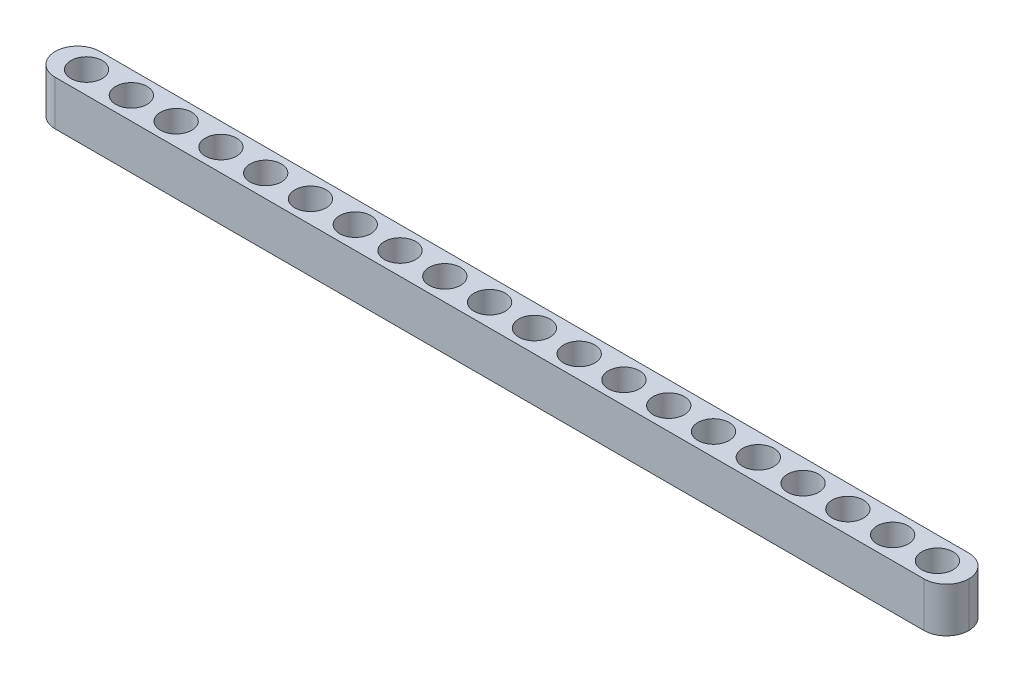
ISO-10303-21;
HEADER;
FILE_DESCRIPTION(('STEP AP214'),'2;1');
FILE_NAME('part.step','',(''),(''),'','','');
FILE_SCHEMA(('AUTOMOTIVE_DESIGN { 1 0 10303 214 1 1 1 1 }'));
ENDSEC;
DATA;
#1=APPLICATION_CONTEXT('core data for automotive mechanical design processes');
#2=APPLICATION_PROTOCOL_DEFINITION('international standard','automotive_design',2000,#1);
#3=PRODUCT_CONTEXT('',#1,'mechanical');
#4=PRODUCT('Part','Part','',(#3));
#5=PRODUCT_RELATED_PRODUCT_CATEGORY('part','',(#4));
#6=PRODUCT_DEFINITION_FORMATION('','',#4);
#7=PRODUCT_DEFINITION_CONTEXT('part definition',#1,'design');
#8=PRODUCT_DEFINITION('design','',#6,#7);
#9=PRODUCT_DEFINITION_SHAPE('','',#8);
#10=(LENGTH_UNIT() NAMED_UNIT(*) SI_UNIT(.MILLI.,.METRE.));
#11=(NAMED_UNIT(*) PLANE_ANGLE_UNIT() SI_UNIT($,.RADIAN.));
#12=(NAMED_UNIT(*) SI_UNIT($,.STERADIAN.) SOLID_ANGLE_UNIT());
#13=UNCERTAINTY_MEASURE_WITH_UNIT(LENGTH_MEASURE(1.E-05),#10,'distance_accuracy_value','');
#14=(GEOMETRIC_REPRESENTATION_CONTEXT(3) GLOBAL_UNCERTAINTY_ASSIGNED_CONTEXT((#13)) GLOBAL_UNIT_ASSIGNED_CONTEXT((#10,
#11,#12)) REPRESENTATION_CONTEXT('',''));
#15=CARTESIAN_POINT('',(0.,0.,0.));
#16=DIRECTION('',(0.,0.,1.));
#17=DIRECTION('',(1.,0.,0.));
#18=AXIS2_PLACEMENT_3D('',#15,#16,#17);
#19=CARTESIAN_POINT('',(197.,0.,-5.));
#20=DIRECTION('',(0.,1.,0.));
#21=DIRECTION('',(0.,0.,1.));
#22=AXIS2_PLACEMENT_3D('',#19,#20,#21);
#23=CYLINDRICAL_SURFACE('',#22,3.5);
#24=CARTESIAN_POINT('',(197.,0.,-5.));
#25=DIRECTION('',(0.,1.,0.));
#26=DIRECTION('',(0.,0.,1.));
#27=AXIS2_PLACEMENT_3D('',#24,#25,#26);
#28=CIRCLE('',#27,3.5);
#29=CARTESIAN_POINT('',(197.,0.,-1.5));
#30=VERTEX_POINT('',#29);
#31=EDGE_CURVE('E132',#30,#30,#28,.T.);
#32=ORIENTED_EDGE('',*,*,#31,.F.);
#33=EDGE_LOOP('',(#32));
#34=FACE_BOUND('',#33,.T.);
#35=CARTESIAN_POINT('',(197.,10.,-5.));
#36=DIRECTION('',(0.,1.,0.));
#37=DIRECTION('',(0.,0.,1.));
#38=AXIS2_PLACEMENT_3D('',#35,#36,#37);
#39=CIRCLE('',#38,3.5);
#40=CARTESIAN_POINT('',(197.,10.,-1.5));
#41=VERTEX_POINT('',#40);
#42=EDGE_CURVE('E128',#41,#41,#39,.T.);
#43=ORIENTED_EDGE('',*,*,#42,.T.);
#44=EDGE_LOOP('',(#43));
#45=FACE_BOUND('',#44,.T.);
#46=ADVANCED_FACE('F46',(#34,#45),#23,.F.);
#47=CARTESIAN_POINT('',(187.,0.,-5.));
#48=DIRECTION('',(0.,1.,0.));
#49=DIRECTION('',(0.,0.,1.));
#50=AXIS2_PLACEMENT_3D('',#47,#48,#49);
#51=CYLINDRICAL_SURFACE('',#50,3.5);
#52=CARTESIAN_POINT('',(187.,0.,-5.));
#53=DIRECTION('',(0.,1.,0.));
#54=DIRECTION('',(0.,0.,1.));
#55=AXIS2_PLACEMENT_3D('',#52,#53,#54);
#56=CIRCLE('',#55,3.5);
#57=CARTESIAN_POINT('',(187.,0.,-1.5));
#58=VERTEX_POINT('',#57);
#59=EDGE_CURVE('E260',#58,#58,#56,.T.);
#60=ORIENTED_EDGE('',*,*,#59,.F.);
#61=EDGE_LOOP('',(#60));
#62=FACE_BOUND('',#61,.T.);
#63=CARTESIAN_POINT('',(187.,10.,-5.));
#64=DIRECTION('',(0.,1.,0.));
#65=DIRECTION('',(0.,0.,1.));
#66=AXIS2_PLACEMENT_3D('',#63,#64,#65);
#67=CIRCLE('',#66,3.5);
#68=CARTESIAN_POINT('',(187.,10.,-1.5));
#69=VERTEX_POINT('',#68);
#70=EDGE_CURVE('E263',#69,#69,#67,.T.);
#71=ORIENTED_EDGE('',*,*,#70,.T.);
#72=EDGE_LOOP('',(#71));
#73=FACE_BOUND('',#72,.T.);
#74=ADVANCED_FACE('F271',(#62,#73),#51,.F.);
#75=CARTESIAN_POINT('',(177.,0.,-5.));
#76=DIRECTION('',(0.,1.,0.));
#77=DIRECTION('',(0.,0.,1.));
#78=AXIS2_PLACEMENT_3D('',#75,#76,#77);
#79=CYLINDRICAL_SURFACE('',#78,3.5);
#80=CARTESIAN_POINT('',(177.,0.,-5.));
#81=DIRECTION('',(0.,1.,0.));
#82=DIRECTION('',(0.,0.,1.));
#83=AXIS2_PLACEMENT_3D('',#80,#81,#82);
#84=CIRCLE('',#83,3.5);
#85=CARTESIAN_POINT('',(177.,0.,-1.5));
#86=VERTEX_POINT('',#85);
#87=EDGE_CURVE('E254',#86,#86,#84,.T.);
#88=ORIENTED_EDGE('',*,*,#87,.F.);
#89=EDGE_LOOP('',(#88));
#90=FACE_BOUND('',#89,.T.);
#91=CARTESIAN_POINT('',(177.,10.,-5.));
#92=DIRECTION('',(0.,1.,0.));
#93=DIRECTION('',(0.,0.,1.));
#94=AXIS2_PLACEMENT_3D('',#91,#92,#93);
#95=CIRCLE('',#94,3.5);
#96=CARTESIAN_POINT('',(177.,10.,-1.5));
#97=VERTEX_POINT('',#96);
#98=EDGE_CURVE('E257',#97,#97,#95,.T.);
#99=ORIENTED_EDGE('',*,*,#98,.T.);
#100=EDGE_LOOP('',(#99));
#101=FACE_BOUND('',#100,.T.);
#102=ADVANCED_FACE('F356',(#90,#101),#79,.F.);
#103=CARTESIAN_POINT('',(167.,0.,-5.));
#104=DIRECTION('',(0.,1.,0.));
#105=DIRECTION('',(0.,0.,1.));
#106=AXIS2_PLACEMENT_3D('',#103,#104,#105);
#107=CYLINDRICAL_SURFACE('',#106,3.5);
#108=CARTESIAN_POINT('',(167.,0.,-5.));
#109=DIRECTION('',(0.,1.,0.));
#110=DIRECTION('',(0.,0.,1.));
#111=AXIS2_PLACEMENT_3D('',#108,#109,#110);
#112=CIRCLE('',#111,3.5);
#113=CARTESIAN_POINT('',(167.,0.,-1.5));
#114=VERTEX_POINT('',#113);
#115=EDGE_CURVE('E248',#114,#114,#112,.T.);
#116=ORIENTED_EDGE('',*,*,#115,.F.);
#117=EDGE_LOOP('',(#116));
#118=FACE_BOUND('',#117,.T.);
#119=CARTESIAN_POINT('',(167.,10.,-5.));
#120=DIRECTION('',(0.,1.,0.));
#121=DIRECTION('',(0.,0.,1.));
#122=AXIS2_PLACEMENT_3D('',#119,#120,#121);
#123=CIRCLE('',#122,3.5);
#124=CARTESIAN_POINT('',(167.,10.,-1.5));
#125=VERTEX_POINT('',#124);
#126=EDGE_CURVE('E251',#125,#125,#123,.T.);
#127=ORIENTED_EDGE('',*,*,#126,.T.);
#128=EDGE_LOOP('',(#127));
#129=FACE_BOUND('',#128,.T.);
#130=ADVANCED_FACE('F352',(#118,#129),#107,.F.);
#131=CARTESIAN_POINT('',(157.,0.,-5.));
#132=DIRECTION('',(0.,1.,0.));
#133=DIRECTION('',(0.,0.,1.));
#134=AXIS2_PLACEMENT_3D('',#131,#132,#133);
#135=CYLINDRICAL_SURFACE('',#134,3.5);
#136=CARTESIAN_POINT('',(157.,0.,-5.));
#137=DIRECTION('',(0.,1.,0.));
#138=DIRECTION('',(0.,0.,1.));
#139=AXIS2_PLACEMENT_3D('',#136,#137,#138);
#140=CIRCLE('',#139,3.5);
#141=CARTESIAN_POINT('',(157.,0.,-1.5));
#142=VERTEX_POINT('',#141);
#143=EDGE_CURVE('E242',#142,#142,#140,.T.);
#144=ORIENTED_EDGE('',*,*,#143,.F.);
#145=EDGE_LOOP('',(#144));
#146=FACE_BOUND('',#145,.T.);
#147=CARTESIAN_POINT('',(157.,10.,-5.));
#148=DIRECTION('',(0.,1.,0.));
#149=DIRECTION('',(0.,0.,1.));
#150=AXIS2_PLACEMENT_3D('',#147,#148,#149);
#151=CIRCLE('',#150,3.5);
#152=CARTESIAN_POINT('',(157.,10.,-1.5));
#153=VERTEX_POINT('',#152);
#154=EDGE_CURVE('E245',#153,#153,#151,.T.);
#155=ORIENTED_EDGE('',*,*,#154,.T.);
#156=EDGE_LOOP('',(#155));
#157=FACE_BOUND('',#156,.T.);
#158=ADVANCED_FACE('F348',(#146,#157),#135,.F.);
#159=CARTESIAN_POINT('',(147.,0.,-5.));
#160=DIRECTION('',(0.,1.,0.));
#161=DIRECTION('',(0.,0.,1.));
#162=AXIS2_PLACEMENT_3D('',#159,#160,#161);
#163=CYLINDRICAL_SURFACE('',#162,3.5);
#164=CARTESIAN_POINT('',(147.,0.,-5.));
#165=DIRECTION('',(0.,1.,0.));
#166=DIRECTION('',(0.,0.,1.));
#167=AXIS2_PLACEMENT_3D('',#164,#165,#166);
#168=CIRCLE('',#167,3.5);
#169=CARTESIAN_POINT('',(147.,0.,-1.5));
#170=VERTEX_POINT('',#169);
#171=EDGE_CURVE('E236',#170,#170,#168,.T.);
#172=ORIENTED_EDGE('',*,*,#171,.F.);
#173=EDGE_LOOP('',(#172));
#174=FACE_BOUND('',#173,.T.);
#175=CARTESIAN_POINT('',(147.,10.,-5.));
#176=DIRECTION('',(0.,1.,0.));
#177=DIRECTION('',(0.,0.,1.));
#178=AXIS2_PLACEMENT_3D('',#175,#176,#177);
#179=CIRCLE('',#178,3.5);
#180=CARTESIAN_POINT('',(147.,10.,-1.5));
#181=VERTEX_POINT('',#180);
#182=EDGE_CURVE('E239',#181,#181,#179,.T.);
#183=ORIENTED_EDGE('',*,*,#182,.T.);
#184=EDGE_LOOP('',(#183));
#185=FACE_BOUND('',#184,.T.);
#186=ADVANCED_FACE('F344',(#174,#185),#163,.F.);
#187=CARTESIAN_POINT('',(137.,0.,-5.));
#188=DIRECTION('',(0.,1.,0.));
#189=DIRECTION('',(0.,0.,1.));
#190=AXIS2_PLACEMENT_3D('',#187,#188,#189);
#191=CYLINDRICAL_SURFACE('',#190,3.5);
#192=CARTESIAN_POINT('',(137.,0.,-5.));
#193=DIRECTION('',(0.,1.,0.));
#194=DIRECTION('',(0.,0.,1.));
#195=AXIS2_PLACEMENT_3D('',#192,#193,#194);
#196=CIRCLE('',#195,3.5);
#197=CARTESIAN_POINT('',(137.,0.,-1.5));
#198=VERTEX_POINT('',#197);
#199=EDGE_CURVE('E230',#198,#198,#196,.T.);
#200=ORIENTED_EDGE('',*,*,#199,.F.);
#201=EDGE_LOOP('',(#200));
#202=FACE_BOUND('',#201,.T.);
#203=CARTESIAN_POINT('',(137.,10.,-5.));
#204=DIRECTION('',(0.,1.,0.));
#205=DIRECTION('',(0.,0.,1.));
#206=AXIS2_PLACEMENT_3D('',#203,#204,#205);
#207=CIRCLE('',#206,3.5);
#208=CARTESIAN_POINT('',(137.,10.,-1.5));
#209=VERTEX_POINT('',#208);
#210=EDGE_CURVE('E233',#209,#209,#207,.T.);
#211=ORIENTED_EDGE('',*,*,#210,.T.);
#212=EDGE_LOOP('',(#211));
#213=FACE_BOUND('',#212,.T.);
#214=ADVANCED_FACE('F340',(#202,#213),#191,.F.);
#215=CARTESIAN_POINT('',(127.,0.,-5.));
#216=DIRECTION('',(0.,1.,0.));
#217=DIRECTION('',(0.,0.,1.));
#218=AXIS2_PLACEMENT_3D('',#215,#216,#217);
#219=CYLINDRICAL_SURFACE('',#218,3.5);
#220=CARTESIAN_POINT('',(127.,0.,-5.));
#221=DIRECTION('',(0.,1.,0.));
#222=DIRECTION('',(0.,0.,1.));
#223=AXIS2_PLACEMENT_3D('',#220,#221,#222);
#224=CIRCLE('',#223,3.5);
#225=CARTESIAN_POINT('',(127.,0.,-1.5));
#226=VERTEX_POINT('',#225);
#227=EDGE_CURVE('E224',#226,#226,#224,.T.);
#228=ORIENTED_EDGE('',*,*,#227,.F.);
#229=EDGE_LOOP('',(#228));
#230=FACE_BOUND('',#229,.T.);
#231=CARTESIAN_POINT('',(127.,10.,-5.));
#232=DIRECTION('',(0.,1.,0.));
#233=DIRECTION('',(0.,0.,1.));
#234=AXIS2_PLACEMENT_3D('',#231,#232,#233);
#235=CIRCLE('',#234,3.5);
#236=CARTESIAN_POINT('',(127.,10.,-1.5));
#237=VERTEX_POINT('',#236);
#238=EDGE_CURVE('E227',#237,#237,#235,.T.);
#239=ORIENTED_EDGE('',*,*,#238,.T.);
#240=EDGE_LOOP('',(#239));
#241=FACE_BOUND('',#240,.T.);
#242=ADVANCED_FACE('F336',(#230,#241),#219,.F.);
#243=CARTESIAN_POINT('',(117.,0.,-5.));
#244=DIRECTION('',(0.,1.,0.));
#245=DIRECTION('',(0.,0.,1.));
#246=AXIS2_PLACEMENT_3D('',#243,#244,#245);
#247=CYLINDRICAL_SURFACE('',#246,3.5);
#248=CARTESIAN_POINT('',(117.,0.,-5.));
#249=DIRECTION('',(0.,1.,0.));
#250=DIRECTION('',(0.,0.,1.));
#251=AXIS2_PLACEMENT_3D('',#248,#249,#250);
#252=CIRCLE('',#251,3.5);
#253=CARTESIAN_POINT('',(117.,0.,-1.5));
#254=VERTEX_POINT('',#253);
#255=EDGE_CURVE('E218',#254,#254,#252,.T.);
#256=ORIENTED_EDGE('',*,*,#255,.F.);
#257=EDGE_LOOP('',(#256));
#258=FACE_BOUND('',#257,.T.);
#259=CARTESIAN_POINT('',(117.,10.,-5.));
#260=DIRECTION('',(0.,1.,0.));
#261=DIRECTION('',(0.,0.,1.));
#262=AXIS2_PLACEMENT_3D('',#259,#260,#261);
#263=CIRCLE('',#262,3.5);
#264=CARTESIAN_POINT('',(117.,10.,-1.5));
#265=VERTEX_POINT('',#264);
#266=EDGE_CURVE('E221',#265,#265,#263,.T.);
#267=ORIENTED_EDGE('',*,*,#266,.T.);
#268=EDGE_LOOP('',(#267));
#269=FACE_BOUND('',#268,.T.);
#270=ADVANCED_FACE('F332',(#258,#269),#247,.F.);
#271=CARTESIAN_POINT('',(107.,0.,-5.));
#272=DIRECTION('',(0.,1.,0.));
#273=DIRECTION('',(0.,0.,1.));
#274=AXIS2_PLACEMENT_3D('',#271,#272,#273);
#275=CYLINDRICAL_SURFACE('',#274,3.5);
#276=CARTESIAN_POINT('',(107.,0.,-5.));
#277=DIRECTION('',(0.,1.,0.));
#278=DIRECTION('',(0.,0.,1.));
#279=AXIS2_PLACEMENT_3D('',#276,#277,#278);
#280=CIRCLE('',#279,3.5);
#281=CARTESIAN_POINT('',(107.,0.,-1.5));
#282=VERTEX_POINT('',#281);
#283=EDGE_CURVE('E212',#282,#282,#280,.T.);
#284=ORIENTED_EDGE('',*,*,#283,.F.);
#285=EDGE_LOOP('',(#284));
#286=FACE_BOUND('',#285,.T.);
#287=CARTESIAN_POINT('',(107.,10.,-5.));
#288=DIRECTION('',(0.,1.,0.));
#289=DIRECTION('',(0.,0.,1.));
#290=AXIS2_PLACEMENT_3D('',#287,#288,#289);
#291=CIRCLE('',#290,3.5);
#292=CARTESIAN_POINT('',(107.,10.,-1.5));
#293=VERTEX_POINT('',#292);
#294=EDGE_CURVE('E215',#293,#293,#291,.T.);
#295=ORIENTED_EDGE('',*,*,#294,.T.);
#296=EDGE_LOOP('',(#295));
#297=FACE_BOUND('',#296,.T.);
#298=ADVANCED_FACE('F328',(#286,#297),#275,.F.);
#299=CARTESIAN_POINT('',(97.,0.,-5.));
#300=DIRECTION('',(0.,1.,0.));
#301=DIRECTION('',(0.,0.,1.));
#302=AXIS2_PLACEMENT_3D('',#299,#300,#301);
#303=CYLINDRICAL_SURFACE('',#302,3.5);
#304=CARTESIAN_POINT('',(97.,0.,-5.));
#305=DIRECTION('',(0.,1.,0.));
#306=DIRECTION('',(0.,0.,1.));
#307=AXIS2_PLACEMENT_3D('',#304,#305,#306);
#308=CIRCLE('',#307,3.5);
#309=CARTESIAN_POINT('',(97.,0.,-1.5));
#310=VERTEX_POINT('',#309);
#311=EDGE_CURVE('E206',#310,#310,#308,.T.);
#312=ORIENTED_EDGE('',*,*,#311,.F.);
#313=EDGE_LOOP('',(#312));
#314=FACE_BOUND('',#313,.T.);
#315=CARTESIAN_POINT('',(97.,10.,-5.));
#316=DIRECTION('',(0.,1.,0.));
#317=DIRECTION('',(0.,0.,1.));
#318=AXIS2_PLACEMENT_3D('',#315,#316,#317);
#319=CIRCLE('',#318,3.5);
#320=CARTESIAN_POINT('',(97.,10.,-1.5));
#321=VERTEX_POINT('',#320);
#322=EDGE_CURVE('E209',#321,#321,#319,.T.);
#323=ORIENTED_EDGE('',*,*,#322,.T.);
#324=EDGE_LOOP('',(#323));
#325=FACE_BOUND('',#324,.T.);
#326=ADVANCED_FACE('F324',(#314,#325),#303,.F.);
#327=CARTESIAN_POINT('',(87.,0.,-5.));
#328=DIRECTION('',(0.,1.,0.));
#329=DIRECTION('',(0.,0.,1.));
#330=AXIS2_PLACEMENT_3D('',#327,#328,#329);
#331=CYLINDRICAL_SURFACE('',#330,3.5);
#332=CARTESIAN_POINT('',(87.,0.,-5.));
#333=DIRECTION('',(0.,1.,0.));
#334=DIRECTION('',(0.,0.,1.));
#335=AXIS2_PLACEMENT_3D('',#332,#333,#334);
#336=CIRCLE('',#335,3.5);
#337=CARTESIAN_POINT('',(87.,0.,-1.5));
#338=VERTEX_POINT('',#337);
#339=EDGE_CURVE('E200',#338,#338,#336,.T.);
#340=ORIENTED_EDGE('',*,*,#339,.F.);
#341=EDGE_LOOP('',(#340));
#342=FACE_BOUND('',#341,.T.);
#343=CARTESIAN_POINT('',(87.,10.,-5.));
#344=DIRECTION('',(0.,1.,0.));
#345=DIRECTION('',(0.,0.,1.));
#346=AXIS2_PLACEMENT_3D('',#343,#344,#345);
#347=CIRCLE('',#346,3.5);
#348=CARTESIAN_POINT('',(87.,10.,-1.5));
#349=VERTEX_POINT('',#348);
#350=EDGE_CURVE('E203',#349,#349,#347,.T.);
#351=ORIENTED_EDGE('',*,*,#350,.T.);
#352=EDGE_LOOP('',(#351));
#353=FACE_BOUND('',#352,.T.);
#354=ADVANCED_FACE('F320',(#342,#353),#331,.F.);
#355=CARTESIAN_POINT('',(77.,0.,-5.));
#356=DIRECTION('',(0.,1.,0.));
#357=DIRECTION('',(0.,0.,1.));
#358=AXIS2_PLACEMENT_3D('',#355,#356,#357);
#359=CYLINDRICAL_SURFACE('',#358,3.5);
#360=CARTESIAN_POINT('',(77.,0.,-5.));
#361=DIRECTION('',(0.,1.,0.));
#362=DIRECTION('',(0.,0.,1.));
#363=AXIS2_PLACEMENT_3D('',#360,#361,#362);
#364=CIRCLE('',#363,3.5);
#365=CARTESIAN_POINT('',(77.,0.,-1.5));
#366=VERTEX_POINT('',#365);
#367=EDGE_CURVE('E194',#366,#366,#364,.T.);
#368=ORIENTED_EDGE('',*,*,#367,.F.);
#369=EDGE_LOOP('',(#368));
#370=FACE_BOUND('',#369,.T.);
#371=CARTESIAN_POINT('',(77.,10.,-5.));
#372=DIRECTION('',(0.,1.,0.));
#373=DIRECTION('',(0.,0.,1.));
#374=AXIS2_PLACEMENT_3D('',#371,#372,#373);
#375=CIRCLE('',#374,3.5);
#376=CARTESIAN_POINT('',(77.,10.,-1.5));
#377=VERTEX_POINT('',#376);
#378=EDGE_CURVE('E197',#377,#377,#375,.T.);
#379=ORIENTED_EDGE('',*,*,#378,.T.);
#380=EDGE_LOOP('',(#379));
#381=FACE_BOUND('',#380,.T.);
#382=ADVANCED_FACE('F316',(#370,#381),#359,.F.);
#383=CARTESIAN_POINT('',(67.,0.,-5.));
#384=DIRECTION('',(0.,1.,0.));
#385=DIRECTION('',(0.,0.,1.));
#386=AXIS2_PLACEMENT_3D('',#383,#384,#385);
#387=CYLINDRICAL_SURFACE('',#386,3.5);
#388=CARTESIAN_POINT('',(67.,0.,-5.));
#389=DIRECTION('',(0.,1.,0.));
#390=DIRECTION('',(0.,0.,1.));
#391=AXIS2_PLACEMENT_3D('',#388,#389,#390);
#392=CIRCLE('',#391,3.5);
#393=CARTESIAN_POINT('',(67.,0.,-1.5));
#394=VERTEX_POINT('',#393);
#395=EDGE_CURVE('E188',#394,#394,#392,.T.);
#396=ORIENTED_EDGE('',*,*,#395,.F.);
#397=EDGE_LOOP('',(#396));
#398=FACE_BOUND('',#397,.T.);
#399=CARTESIAN_POINT('',(67.,10.,-5.));
#400=DIRECTION('',(0.,1.,0.));
#401=DIRECTION('',(0.,0.,1.));
#402=AXIS2_PLACEMENT_3D('',#399,#400,#401);
#403=CIRCLE('',#402,3.5);
#404=CARTESIAN_POINT('',(67.,10.,-1.5));
#405=VERTEX_POINT('',#404);
#406=EDGE_CURVE('E191',#405,#405,#403,.T.);
#407=ORIENTED_EDGE('',*,*,#406,.T.);
#408=EDGE_LOOP('',(#407));
#409=FACE_BOUND('',#408,.T.);
#410=ADVANCED_FACE('F312',(#398,#409),#387,.F.);
#411=CARTESIAN_POINT('',(57.,0.,-5.));
#412=DIRECTION('',(0.,1.,0.));
#413=DIRECTION('',(0.,0.,1.));
#414=AXIS2_PLACEMENT_3D('',#411,#412,#413);
#415=CYLINDRICAL_SURFACE('',#414,3.5);
#416=CARTESIAN_POINT('',(57.,0.,-5.));
#417=DIRECTION('',(0.,1.,0.));
#418=DIRECTION('',(0.,0.,1.));
#419=AXIS2_PLACEMENT_3D('',#416,#417,#418);
#420=CIRCLE('',#419,3.5);
#421=CARTESIAN_POINT('',(57.,0.,-1.5));
#422=VERTEX_POINT('',#421);
#423=EDGE_CURVE('E182',#422,#422,#420,.T.);
#424=ORIENTED_EDGE('',*,*,#423,.F.);
#425=EDGE_LOOP('',(#424));
#426=FACE_BOUND('',#425,.T.);
#427=CARTESIAN_POINT('',(57.,10.,-5.));
#428=DIRECTION('',(0.,1.,0.));
#429=DIRECTION('',(0.,0.,1.));
#430=AXIS2_PLACEMENT_3D('',#427,#428,#429);
#431=CIRCLE('',#430,3.5);
#432=CARTESIAN_POINT('',(57.,10.,-1.5));
#433=VERTEX_POINT('',#432);
#434=EDGE_CURVE('E185',#433,#433,#431,.T.);
#435=ORIENTED_EDGE('',*,*,#434,.T.);
#436=EDGE_LOOP('',(#435));
#437=FACE_BOUND('',#436,.T.);
#438=ADVANCED_FACE('F308',(#426,#437),#415,.F.);
#439=CARTESIAN_POINT('',(47.,0.,-5.));
#440=DIRECTION('',(0.,1.,0.));
#441=DIRECTION('',(0.,0.,1.));
#442=AXIS2_PLACEMENT_3D('',#439,#440,#441);
#443=CYLINDRICAL_SURFACE('',#442,3.5);
#444=CARTESIAN_POINT('',(47.,0.,-5.));
#445=DIRECTION('',(0.,1.,0.));
#446=DIRECTION('',(0.,0.,1.));
#447=AXIS2_PLACEMENT_3D('',#444,#445,#446);
#448=CIRCLE('',#447,3.5);
#449=CARTESIAN_POINT('',(47.,0.,-1.5));
#450=VERTEX_POINT('',#449);
#451=EDGE_CURVE('E176',#450,#450,#448,.T.);
#452=ORIENTED_EDGE('',*,*,#451,.F.);
#453=EDGE_LOOP('',(#452));
#454=FACE_BOUND('',#453,.T.);
#455=CARTESIAN_POINT('',(47.,10.,-5.));
#456=DIRECTION('',(0.,1.,0.));
#457=DIRECTION('',(0.,0.,1.));
#458=AXIS2_PLACEMENT_3D('',#455,#456,#457);
#459=CIRCLE('',#458,3.5);
#460=CARTESIAN_POINT('',(47.,10.,-1.5));
#461=VERTEX_POINT('',#460);
#462=EDGE_CURVE('E179',#461,#461,#459,.T.);
#463=ORIENTED_EDGE('',*,*,#462,.T.);
#464=EDGE_LOOP('',(#463));
#465=FACE_BOUND('',#464,.T.);
#466=ADVANCED_FACE('F304',(#454,#465),#443,.F.);
#467=CARTESIAN_POINT('',(37.,0.,-5.));
#468=DIRECTION('',(0.,1.,0.));
#469=DIRECTION('',(0.,0.,1.));
#470=AXIS2_PLACEMENT_3D('',#467,#468,#469);
#471=CYLINDRICAL_SURFACE('',#470,3.5);
#472=CARTESIAN_POINT('',(37.,0.,-5.));
#473=DIRECTION('',(0.,1.,0.));
#474=DIRECTION('',(0.,0.,1.));
#475=AXIS2_PLACEMENT_3D('',#472,#473,#474);
#476=CIRCLE('',#475,3.5);
#477=CARTESIAN_POINT('',(37.,0.,-1.5));
#478=VERTEX_POINT('',#477);
#479=EDGE_CURVE('E170',#478,#478,#476,.T.);
#480=ORIENTED_EDGE('',*,*,#479,.F.);
#481=EDGE_LOOP('',(#480));
#482=FACE_BOUND('',#481,.T.);
#483=CARTESIAN_POINT('',(37.,10.,-5.));
#484=DIRECTION('',(0.,1.,0.));
#485=DIRECTION('',(0.,0.,1.));
#486=AXIS2_PLACEMENT_3D('',#483,#484,#485);
#487=CIRCLE('',#486,3.5);
#488=CARTESIAN_POINT('',(37.,10.,-1.5));
#489=VERTEX_POINT('',#488);
#490=EDGE_CURVE('E173',#489,#489,#487,.T.);
#491=ORIENTED_EDGE('',*,*,#490,.T.);
#492=EDGE_LOOP('',(#491));
#493=FACE_BOUND('',#492,.T.);
#494=ADVANCED_FACE('F300',(#482,#493),#471,.F.);
#495=CARTESIAN_POINT('',(27.,0.,-5.));
#496=DIRECTION('',(0.,1.,0.));
#497=DIRECTION('',(0.,0.,1.));
#498=AXIS2_PLACEMENT_3D('',#495,#496,#497);
#499=CYLINDRICAL_SURFACE('',#498,3.5);
#500=CARTESIAN_POINT('',(27.,0.,-5.));
#501=DIRECTION('',(0.,1.,0.));
#502=DIRECTION('',(0.,0.,1.));
#503=AXIS2_PLACEMENT_3D('',#500,#501,#502);
#504=CIRCLE('',#503,3.5);
#505=CARTESIAN_POINT('',(27.,0.,-1.5));
#506=VERTEX_POINT('',#505);
#507=EDGE_CURVE('E123',#506,#506,#504,.T.);
#508=ORIENTED_EDGE('',*,*,#507,.F.);
#509=EDGE_LOOP('',(#508));
#510=FACE_BOUND('',#509,.T.);
#511=CARTESIAN_POINT('',(27.,10.,-5.));
#512=DIRECTION('',(0.,1.,0.));
#513=DIRECTION('',(0.,0.,1.));
#514=AXIS2_PLACEMENT_3D('',#511,#512,#513);
#515=CIRCLE('',#514,3.5);
#516=CARTESIAN_POINT('',(27.,10.,-1.5));
#517=VERTEX_POINT('',#516);
#518=EDGE_CURVE('E167',#517,#517,#515,.T.);
#519=ORIENTED_EDGE('',*,*,#518,.T.);
#520=EDGE_LOOP('',(#519));
#521=FACE_BOUND('',#520,.T.);
#522=ADVANCED_FACE('F297',(#510,#521),#499,.F.);
#523=CARTESIAN_POINT('',(204.,0.,0.));
#524=DIRECTION('',(0.,0.,-1.));
#525=DIRECTION('',(-1.,0.,0.));
#526=AXIS2_PLACEMENT_3D('',#523,#524,#525);
#527=PLANE('',#526);
#528=DIRECTION('',(-1.,0.,0.));
#529=VECTOR('',#528,1.);
#530=CARTESIAN_POINT('',(204.,10.,0.));
#531=LINE('',#530,#529);
#532=CARTESIAN_POINT('',(199.,10.,0.));
#533=VERTEX_POINT('',#532);
#534=CARTESIAN_POINT('',(5.,10.,0.));
#535=VERTEX_POINT('',#534);
#536=EDGE_CURVE('E161',#533,#535,#531,.T.);
#537=ORIENTED_EDGE('',*,*,#536,.T.);
#538=DIRECTION('',(0.,-1.,0.));
#539=VECTOR('',#538,1.);
#540=CARTESIAN_POINT('',(5.,0.,0.));
#541=LINE('',#540,#539);
#542=CARTESIAN_POINT('',(5.,0.,0.));
#543=VERTEX_POINT('',#542);
#544=EDGE_CURVE('E122',#535,#543,#541,.T.);
#545=ORIENTED_EDGE('',*,*,#544,.T.);
#546=DIRECTION('',(-1.,0.,0.));
#547=VECTOR('',#546,1.);
#548=CARTESIAN_POINT('',(204.,0.,0.));
#549=LINE('',#548,#547);
#550=CARTESIAN_POINT('',(199.,0.,0.));
#551=VERTEX_POINT('',#550);
#552=EDGE_CURVE('E104',#551,#543,#549,.T.);
#553=ORIENTED_EDGE('',*,*,#552,.F.);
#554=DIRECTION('',(0.,-1.,0.));
#555=VECTOR('',#554,1.);
#556=CARTESIAN_POINT('',(199.,0.,0.));
#557=LINE('',#556,#555);
#558=EDGE_CURVE('E119',#551,#533,#557,.F.);
#559=ORIENTED_EDGE('',*,*,#558,.T.);
#560=EDGE_LOOP('',(#537,#545,#553,#559));
#561=FACE_BOUND('',#560,.T.);
#562=ADVANCED_FACE('F118',(#561),#527,.F.);
#563=CARTESIAN_POINT('',(204.,0.,0.));
#564=DIRECTION('',(0.,1.,0.));
#565=DIRECTION('',(0.,0.,1.));
#566=AXIS2_PLACEMENT_3D('',#563,#564,#565);
#567=PLANE('',#566);
#568=CARTESIAN_POINT('',(17.,0.,-5.));
#569=DIRECTION('',(0.,1.,0.));
#570=DIRECTION('',(0.,0.,1.));
#571=AXIS2_PLACEMENT_3D('',#568,#569,#570);
#572=CIRCLE('',#571,3.5);
#573=CARTESIAN_POINT('',(17.,0.,-1.5));
#574=VERTEX_POINT('',#573);
#575=EDGE_CURVE('E148',#574,#574,#572,.T.);
#576=ORIENTED_EDGE('',*,*,#575,.T.);
#577=EDGE_LOOP('',(#576));
#578=FACE_BOUND('',#577,.T.);
#579=CARTESIAN_POINT('',(7.,0.,-5.));
#580=DIRECTION('',(0.,1.,0.));
#581=DIRECTION('',(0.,0.,1.));
#582=AXIS2_PLACEMENT_3D('',#579,#580,#581);
#583=CIRCLE('',#582,3.5);
#584=CARTESIAN_POINT('',(7.,0.,-1.5));
#585=VERTEX_POINT('',#584);
#586=EDGE_CURVE('E546',#585,#585,#583,.T.);
#587=ORIENTED_EDGE('',*,*,#586,.T.);
#588=EDGE_LOOP('',(#587));
#589=FACE_BOUND('',#588,.T.);
#590=ORIENTED_EDGE('',*,*,#552,.T.);
#591=CARTESIAN_POINT('',(5.,0.,-5.));
#592=DIRECTION('',(0.,1.,0.));
#593=DIRECTION('',(0.,0.,1.));
#594=AXIS2_PLACEMENT_3D('',#591,#592,#593);
#595=CIRCLE('',#594,5.);
#596=CARTESIAN_POINT('',(0.,0.,-5.));
#597=VERTEX_POINT('',#596);
#598=EDGE_CURVE('E138',#543,#597,#595,.F.);
#599=ORIENTED_EDGE('',*,*,#598,.T.);
#600=CARTESIAN_POINT('',(5.,0.,-5.));
#601=DIRECTION('',(0.,1.,0.));
#602=DIRECTION('',(0.,0.,1.));
#603=AXIS2_PLACEMENT_3D('',#600,#601,#602);
#604=CIRCLE('',#603,5.);
#605=CARTESIAN_POINT('',(5.,0.,-10.));
#606=VERTEX_POINT('',#605);
#607=EDGE_CURVE('E112',#597,#606,#604,.F.);
#608=ORIENTED_EDGE('',*,*,#607,.T.);
#609=DIRECTION('',(-1.,0.,0.));
#610=VECTOR('',#609,1.);
#611=CARTESIAN_POINT('',(204.,0.,-10.));
#612=LINE('',#611,#610);
#613=CARTESIAN_POINT('',(199.,0.,-10.));
#614=VERTEX_POINT('',#613);
#615=EDGE_CURVE('E124',#614,#606,#612,.T.);
#616=ORIENTED_EDGE('',*,*,#615,.F.);
#617=CARTESIAN_POINT('',(199.,0.,-5.));
#618=DIRECTION('',(0.,1.,0.));
#619=DIRECTION('',(0.,0.,1.));
#620=AXIS2_PLACEMENT_3D('',#617,#618,#619);
#621=CIRCLE('',#620,5.);
#622=CARTESIAN_POINT('',(204.,0.,-5.));
#623=VERTEX_POINT('',#622);
#624=EDGE_CURVE('E107',#614,#623,#621,.F.);
#625=ORIENTED_EDGE('',*,*,#624,.T.);
#626=CARTESIAN_POINT('',(199.,0.,-5.));
#627=DIRECTION('',(0.,1.,0.));
#628=DIRECTION('',(0.,0.,1.));
#629=AXIS2_PLACEMENT_3D('',#626,#627,#628);
#630=CIRCLE('',#629,5.);
#631=EDGE_CURVE('E100',#623,#551,#630,.F.);
#632=ORIENTED_EDGE('',*,*,#631,.T.);
#633=EDGE_LOOP('',(#590,#599,#608,#616,#625,#632));
#634=FACE_BOUND('',#633,.T.);
#635=ORIENTED_EDGE('',*,*,#507,.T.);
#636=EDGE_LOOP('',(#635));
#637=FACE_BOUND('',#636,.T.);
#638=ORIENTED_EDGE('',*,*,#479,.T.);
#639=EDGE_LOOP('',(#638));
#640=FACE_BOUND('',#639,.T.);
#641=ORIENTED_EDGE('',*,*,#451,.T.);
#642=EDGE_LOOP('',(#641));
#643=FACE_BOUND('',#642,.T.);
#644=ORIENTED_EDGE('',*,*,#423,.T.);
#645=EDGE_LOOP('',(#644));
#646=FACE_BOUND('',#645,.T.);
#647=ORIENTED_EDGE('',*,*,#395,.T.);
#648=EDGE_LOOP('',(#647));
#649=FACE_BOUND('',#648,.T.);
#650=ORIENTED_EDGE('',*,*,#367,.T.);
#651=EDGE_LOOP('',(#650));
#652=FACE_BOUND('',#651,.T.);
#653=ORIENTED_EDGE('',*,*,#339,.T.);
#654=EDGE_LOOP('',(#653));
#655=FACE_BOUND('',#654,.T.);
#656=ORIENTED_EDGE('',*,*,#311,.T.);
#657=EDGE_LOOP('',(#656));
#658=FACE_BOUND('',#657,.T.);
#659=ORIENTED_EDGE('',*,*,#283,.T.);
#660=EDGE_LOOP('',(#659));
#661=FACE_BOUND('',#660,.T.);
#662=ORIENTED_EDGE('',*,*,#255,.T.);
#663=EDGE_LOOP('',(#662));
#664=FACE_BOUND('',#663,.T.);
#665=ORIENTED_EDGE('',*,*,#227,.T.);
#666=EDGE_LOOP('',(#665));
#667=FACE_BOUND('',#666,.T.);
#668=ORIENTED_EDGE('',*,*,#199,.T.);
#669=EDGE_LOOP('',(#668));
#670=FACE_BOUND('',#669,.T.);
#671=ORIENTED_EDGE('',*,*,#171,.T.);
#672=EDGE_LOOP('',(#671));
#673=FACE_BOUND('',#672,.T.);
#674=ORIENTED_EDGE('',*,*,#143,.T.);
#675=EDGE_LOOP('',(#674));
#676=FACE_BOUND('',#675,.T.);
#677=ORIENTED_EDGE('',*,*,#115,.T.);
#678=EDGE_LOOP('',(#677));
#679=FACE_BOUND('',#678,.T.);
#680=ORIENTED_EDGE('',*,*,#87,.T.);
#681=EDGE_LOOP('',(#680));
#682=FACE_BOUND('',#681,.T.);
#683=ORIENTED_EDGE('',*,*,#59,.T.);
#684=EDGE_LOOP('',(#683));
#685=FACE_BOUND('',#684,.T.);
#686=ORIENTED_EDGE('',*,*,#31,.T.);
#687=EDGE_LOOP('',(#686));
#688=FACE_BOUND('',#687,.T.);
#689=ADVANCED_FACE('F102',(#578,#589,#634,#637,#640,#643,#646,#649,#652,#655,#658,#661,#664,
#667,#670,#673,#676,#679,#682,#685,#688),#567,.F.);
#690=CARTESIAN_POINT('',(204.,0.,-10.));
#691=DIRECTION('',(0.,0.,1.));
#692=DIRECTION('',(1.,0.,0.));
#693=AXIS2_PLACEMENT_3D('',#690,#691,#692);
#694=PLANE('',#693);
#695=ORIENTED_EDGE('',*,*,#615,.T.);
#696=DIRECTION('',(0.,1.,0.));
#697=VECTOR('',#696,1.);
#698=CARTESIAN_POINT('',(5.,10.,-10.));
#699=LINE('',#698,#697);
#700=CARTESIAN_POINT('',(5.,10.,-10.));
#701=VERTEX_POINT('',#700);
#702=EDGE_CURVE('E13',#606,#701,#699,.T.);
#703=ORIENTED_EDGE('',*,*,#702,.T.);
#704=DIRECTION('',(-1.,0.,0.));
#705=VECTOR('',#704,1.);
#706=CARTESIAN_POINT('',(204.,10.,-10.));
#707=LINE('',#706,#705);
#708=CARTESIAN_POINT('',(199.,10.,-10.));
#709=VERTEX_POINT('',#708);
#710=EDGE_CURVE('E158',#709,#701,#707,.T.);
#711=ORIENTED_EDGE('',*,*,#710,.F.);
#712=DIRECTION('',(0.,1.,0.));
#713=VECTOR('',#712,1.);
#714=CARTESIAN_POINT('',(199.,0.,-10.));
#715=LINE('',#714,#713);
#716=EDGE_CURVE('E55',#709,#614,#715,.F.);
#717=ORIENTED_EDGE('',*,*,#716,.T.);
#718=EDGE_LOOP('',(#695,#703,#711,#717));
#719=FACE_BOUND('',#718,.T.);
#720=ADVANCED_FACE('F157',(#719),#694,.F.);
#721=CARTESIAN_POINT('',(204.,10.,0.));
#722=DIRECTION('',(0.,-1.,0.));
#723=DIRECTION('',(0.,0.,-1.));
#724=AXIS2_PLACEMENT_3D('',#721,#722,#723);
#725=PLANE('',#724);
#726=CARTESIAN_POINT('',(17.,10.,-5.));
#727=DIRECTION('',(0.,1.,0.));
#728=DIRECTION('',(0.,0.,1.));
#729=AXIS2_PLACEMENT_3D('',#726,#727,#728);
#730=CIRCLE('',#729,3.5);
#731=CARTESIAN_POINT('',(17.,10.,-1.5));
#732=VERTEX_POINT('',#731);
#733=EDGE_CURVE('E153',#732,#732,#730,.T.);
#734=ORIENTED_EDGE('',*,*,#733,.F.);
#735=EDGE_LOOP('',(#734));
#736=FACE_BOUND('',#735,.T.);
#737=CARTESIAN_POINT('',(7.,10.,-5.));
#738=DIRECTION('',(0.,1.,0.));
#739=DIRECTION('',(0.,0.,1.));
#740=AXIS2_PLACEMENT_3D('',#737,#738,#739);
#741=CIRCLE('',#740,3.5);
#742=CARTESIAN_POINT('',(7.,10.,-1.5));
#743=VERTEX_POINT('',#742);
#744=EDGE_CURVE('E543',#743,#743,#741,.T.);
#745=ORIENTED_EDGE('',*,*,#744,.F.);
#746=EDGE_LOOP('',(#745));
#747=FACE_BOUND('',#746,.T.);
#748=CARTESIAN_POINT('',(5.,10.,-5.));
#749=DIRECTION('',(0.,-1.,0.));
#750=DIRECTION('',(0.,0.,-1.));
#751=AXIS2_PLACEMENT_3D('',#748,#749,#750);
#752=CIRCLE('',#751,5.);
#753=CARTESIAN_POINT('',(0.,10.,-5.));
#754=VERTEX_POINT('',#753);
#755=EDGE_CURVE('E142',#701,#754,#752,.F.);
#756=ORIENTED_EDGE('',*,*,#755,.T.);
#757=CARTESIAN_POINT('',(5.,10.,-5.));
#758=DIRECTION('',(0.,-1.,0.));
#759=DIRECTION('',(0.,0.,-1.));
#760=AXIS2_PLACEMENT_3D('',#757,#758,#759);
#761=CIRCLE('',#760,5.);
#762=EDGE_CURVE('E144',#754,#535,#761,.F.);
#763=ORIENTED_EDGE('',*,*,#762,.T.);
#764=ORIENTED_EDGE('',*,*,#536,.F.);
#765=CARTESIAN_POINT('',(199.,10.,-5.));
#766=DIRECTION('',(0.,-1.,0.));
#767=DIRECTION('',(0.,0.,-1.));
#768=AXIS2_PLACEMENT_3D('',#765,#766,#767);
#769=CIRCLE('',#768,5.);
#770=CARTESIAN_POINT('',(204.,10.,-5.));
#771=VERTEX_POINT('',#770);
#772=EDGE_CURVE('E127',#533,#771,#769,.F.);
#773=ORIENTED_EDGE('',*,*,#772,.T.);
#774=CARTESIAN_POINT('',(199.,10.,-5.));
#775=DIRECTION('',(0.,-1.,0.));
#776=DIRECTION('',(0.,0.,-1.));
#777=AXIS2_PLACEMENT_3D('',#774,#775,#776);
#778=CIRCLE('',#777,5.);
#779=EDGE_CURVE('E68',#771,#709,#778,.F.);
#780=ORIENTED_EDGE('',*,*,#779,.T.);
#781=ORIENTED_EDGE('',*,*,#710,.T.);
#782=EDGE_LOOP('',(#756,#763,#764,#773,#780,#781));
#783=FACE_BOUND('',#782,.T.);
#784=ORIENTED_EDGE('',*,*,#518,.F.);
#785=EDGE_LOOP('',(#784));
#786=FACE_BOUND('',#785,.T.);
#787=ORIENTED_EDGE('',*,*,#490,.F.);
#788=EDGE_LOOP('',(#787));
#789=FACE_BOUND('',#788,.T.);
#790=ORIENTED_EDGE('',*,*,#462,.F.);
#791=EDGE_LOOP('',(#790));
#792=FACE_BOUND('',#791,.T.);
#793=ORIENTED_EDGE('',*,*,#434,.F.);
#794=EDGE_LOOP('',(#793));
#795=FACE_BOUND('',#794,.T.);
#796=ORIENTED_EDGE('',*,*,#406,.F.);
#797=EDGE_LOOP('',(#796));
#798=FACE_BOUND('',#797,.T.);
#799=ORIENTED_EDGE('',*,*,#378,.F.);
#800=EDGE_LOOP('',(#799));
#801=FACE_BOUND('',#800,.T.);
#802=ORIENTED_EDGE('',*,*,#350,.F.);
#803=EDGE_LOOP('',(#802));
#804=FACE_BOUND('',#803,.T.);
#805=ORIENTED_EDGE('',*,*,#322,.F.);
#806=EDGE_LOOP('',(#805));
#807=FACE_BOUND('',#806,.T.);
#808=ORIENTED_EDGE('',*,*,#294,.F.);
#809=EDGE_LOOP('',(#808));
#810=FACE_BOUND('',#809,.T.);
#811=ORIENTED_EDGE('',*,*,#266,.F.);
#812=EDGE_LOOP('',(#811));
#813=FACE_BOUND('',#812,.T.);
#814=ORIENTED_EDGE('',*,*,#238,.F.);
#815=EDGE_LOOP('',(#814));
#816=FACE_BOUND('',#815,.T.);
#817=ORIENTED_EDGE('',*,*,#210,.F.);
#818=EDGE_LOOP('',(#817));
#819=FACE_BOUND('',#818,.T.);
#820=ORIENTED_EDGE('',*,*,#182,.F.);
#821=EDGE_LOOP('',(#820));
#822=FACE_BOUND('',#821,.T.);
#823=ORIENTED_EDGE('',*,*,#154,.F.);
#824=EDGE_LOOP('',(#823));
#825=FACE_BOUND('',#824,.T.);
#826=ORIENTED_EDGE('',*,*,#126,.F.);
#827=EDGE_LOOP('',(#826));
#828=FACE_BOUND('',#827,.T.);
#829=ORIENTED_EDGE('',*,*,#98,.F.);
#830=EDGE_LOOP('',(#829));
#831=FACE_BOUND('',#830,.T.);
#832=ORIENTED_EDGE('',*,*,#70,.F.);
#833=EDGE_LOOP('',(#832));
#834=FACE_BOUND('',#833,.T.);
#835=ORIENTED_EDGE('',*,*,#42,.F.);
#836=EDGE_LOOP('',(#835));
#837=FACE_BOUND('',#836,.T.);
#838=ADVANCED_FACE('F275',(#736,#747,#783,#786,#789,#792,#795,#798,#801,#804,#807,#810,#813,
#816,#819,#822,#825,#828,#831,#834,#837),#725,.F.);
#839=CARTESIAN_POINT('',(7.,0.,-5.));
#840=DIRECTION('',(0.,1.,0.));
#841=DIRECTION('',(0.,0.,1.));
#842=AXIS2_PLACEMENT_3D('',#839,#840,#841);
#843=CYLINDRICAL_SURFACE('',#842,3.5);
#844=ORIENTED_EDGE('',*,*,#586,.F.);
#845=EDGE_LOOP('',(#844));
#846=FACE_BOUND('',#845,.T.);
#847=ORIENTED_EDGE('',*,*,#744,.T.);
#848=EDGE_LOOP('',(#847));
#849=FACE_BOUND('',#848,.T.);
#850=ADVANCED_FACE('F277',(#846,#849),#843,.F.);
#851=CARTESIAN_POINT('',(17.,0.,-5.));
#852=DIRECTION('',(0.,1.,0.));
#853=DIRECTION('',(0.,0.,1.));
#854=AXIS2_PLACEMENT_3D('',#851,#852,#853);
#855=CYLINDRICAL_SURFACE('',#854,3.5);
#856=ORIENTED_EDGE('',*,*,#575,.F.);
#857=EDGE_LOOP('',(#856));
#858=FACE_BOUND('',#857,.T.);
#859=ORIENTED_EDGE('',*,*,#733,.T.);
#860=EDGE_LOOP('',(#859));
#861=FACE_BOUND('',#860,.T.);
#862=ADVANCED_FACE('F284',(#858,#861),#855,.F.);
#863=CARTESIAN_POINT('',(5.,0.,-5.));
#864=DIRECTION('',(0.,-1.,0.));
#865=DIRECTION('',(0.,0.,-1.));
#866=AXIS2_PLACEMENT_3D('',#863,#864,#865);
#867=CYLINDRICAL_SURFACE('',#866,5.);
#868=DIRECTION('',(0.,1.,0.));
#869=VECTOR('',#868,1.);
#870=CARTESIAN_POINT('',(0.,0.,-5.));
#871=LINE('',#870,#869);
#872=EDGE_CURVE('E146',#754,#597,#871,.F.);
#873=ORIENTED_EDGE('',*,*,#872,.F.);
#874=ORIENTED_EDGE('',*,*,#755,.F.);
#875=ORIENTED_EDGE('',*,*,#702,.F.);
#876=ORIENTED_EDGE('',*,*,#607,.F.);
#877=EDGE_LOOP('',(#873,#874,#875,#876));
#878=FACE_BOUND('',#877,.T.);
#879=ADVANCED_FACE('F367',(#878),#867,.T.);
#880=CARTESIAN_POINT('',(5.,0.,-5.));
#881=DIRECTION('',(0.,1.,0.));
#882=DIRECTION('',(0.,0.,1.));
#883=AXIS2_PLACEMENT_3D('',#880,#881,#882);
#884=CYLINDRICAL_SURFACE('',#883,5.);
#885=ORIENTED_EDGE('',*,*,#762,.F.);
#886=ORIENTED_EDGE('',*,*,#872,.T.);
#887=ORIENTED_EDGE('',*,*,#598,.F.);
#888=ORIENTED_EDGE('',*,*,#544,.F.);
#889=EDGE_LOOP('',(#885,#886,#887,#888));
#890=FACE_BOUND('',#889,.T.);
#891=ADVANCED_FACE('F364',(#890),#884,.T.);
#892=CARTESIAN_POINT('',(199.,0.,-5.));
#893=DIRECTION('',(0.,1.,0.));
#894=DIRECTION('',(0.,0.,1.));
#895=AXIS2_PLACEMENT_3D('',#892,#893,#894);
#896=CYLINDRICAL_SURFACE('',#895,5.);
#897=ORIENTED_EDGE('',*,*,#716,.F.);
#898=ORIENTED_EDGE('',*,*,#779,.F.);
#899=DIRECTION('',(0.,1.,0.));
#900=VECTOR('',#899,1.);
#901=CARTESIAN_POINT('',(204.,0.,-5.));
#902=LINE('',#901,#900);
#903=EDGE_CURVE('E50',#623,#771,#902,.T.);
#904=ORIENTED_EDGE('',*,*,#903,.F.);
#905=ORIENTED_EDGE('',*,*,#624,.F.);
#906=EDGE_LOOP('',(#897,#898,#904,#905));
#907=FACE_BOUND('',#906,.T.);
#908=ADVANCED_FACE('F48',(#907),#896,.T.);
#909=CARTESIAN_POINT('',(199.,0.,-5.));
#910=DIRECTION('',(0.,-1.,0.));
#911=DIRECTION('',(0.,0.,-1.));
#912=AXIS2_PLACEMENT_3D('',#909,#910,#911);
#913=CYLINDRICAL_SURFACE('',#912,5.);
#914=ORIENTED_EDGE('',*,*,#772,.F.);
#915=ORIENTED_EDGE('',*,*,#558,.F.);
#916=ORIENTED_EDGE('',*,*,#631,.F.);
#917=ORIENTED_EDGE('',*,*,#903,.T.);
#918=EDGE_LOOP('',(#914,#915,#916,#917));
#919=FACE_BOUND('',#918,.T.);
#920=ADVANCED_FACE('F126',(#919),#913,.T.);
#921=CLOSED_SHELL('',(#46,#74,#102,#130,#158,#186,#214,#242,#270,#298,#326,#354,#382,#410,#438,
#466,#494,#522,#562,#689,#720,#838,#850,#862,#879,#891,#908,#920));
#922=MANIFOLD_SOLID_BREP('B2',#921);
#923=ADVANCED_BREP_SHAPE_REPRESENTATION('',(#18,#922),#14);
#924=SHAPE_DEFINITION_REPRESENTATION(#9,#923);
ENDSEC;
END-ISO-10303-21;
